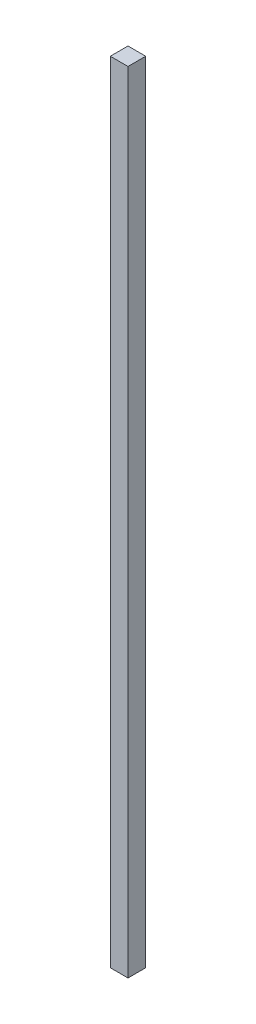
ISO-10303-21;
HEADER;
FILE_DESCRIPTION(('STEP AP214'),'2;1');
FILE_NAME('part.step','',(''),(''),'','','');
FILE_SCHEMA(('AUTOMOTIVE_DESIGN { 1 0 10303 214 1 1 1 1 }'));
ENDSEC;
DATA;
#1=APPLICATION_CONTEXT('core data for automotive mechanical design processes');
#2=APPLICATION_PROTOCOL_DEFINITION('international standard','automotive_design',2000,#1);
#3=PRODUCT_CONTEXT('',#1,'mechanical');
#4=PRODUCT('Part','Part','',(#3));
#5=PRODUCT_RELATED_PRODUCT_CATEGORY('part','',(#4));
#6=PRODUCT_DEFINITION_FORMATION('','',#4);
#7=PRODUCT_DEFINITION_CONTEXT('part definition',#1,'design');
#8=PRODUCT_DEFINITION('design','',#6,#7);
#9=PRODUCT_DEFINITION_SHAPE('','',#8);
#10=(LENGTH_UNIT() NAMED_UNIT(*) SI_UNIT(.MILLI.,.METRE.));
#11=(NAMED_UNIT(*) PLANE_ANGLE_UNIT() SI_UNIT($,.RADIAN.));
#12=(NAMED_UNIT(*) SI_UNIT($,.STERADIAN.) SOLID_ANGLE_UNIT());
#13=UNCERTAINTY_MEASURE_WITH_UNIT(LENGTH_MEASURE(1.E-05),#10,'distance_accuracy_value','');
#14=(GEOMETRIC_REPRESENTATION_CONTEXT(3) GLOBAL_UNCERTAINTY_ASSIGNED_CONTEXT((#13)) GLOBAL_UNIT_ASSIGNED_CONTEXT((#10,
#11,#12)) REPRESENTATION_CONTEXT('',''));
#15=CARTESIAN_POINT('',(0.,0.,0.));
#16=DIRECTION('',(0.,0.,1.));
#17=DIRECTION('',(1.,0.,0.));
#18=AXIS2_PLACEMENT_3D('',#15,#16,#17);
#19=CARTESIAN_POINT('',(44.45,0.,-44.45));
#20=DIRECTION('',(0.,0.,-1.));
#21=DIRECTION('',(-1.,0.,0.));
#22=AXIS2_PLACEMENT_3D('',#19,#20,#21);
#23=PLANE('',#22);
#24=DIRECTION('',(1.,0.,0.));
#25=VECTOR('',#24,1.);
#26=CARTESIAN_POINT('',(0.,1981.2,-44.45));
#27=LINE('',#26,#25);
#28=CARTESIAN_POINT('',(44.45,1981.2,-44.45));
#29=VERTEX_POINT('',#28);
#30=CARTESIAN_POINT('',(0.,1981.2,-44.45));
#31=VERTEX_POINT('',#30);
#32=EDGE_CURVE('E84',#29,#31,#27,.F.);
#33=ORIENTED_EDGE('',*,*,#32,.F.);
#34=DIRECTION('',(0.,1.,0.));
#35=VECTOR('',#34,1.);
#36=CARTESIAN_POINT('',(44.45,0.,-44.45));
#37=LINE('',#36,#35);
#38=CARTESIAN_POINT('',(44.45,0.,-44.45));
#39=VERTEX_POINT('',#38);
#40=EDGE_CURVE('E71',#39,#29,#37,.T.);
#41=ORIENTED_EDGE('',*,*,#40,.F.);
#42=DIRECTION('',(1.,0.,0.));
#43=VECTOR('',#42,1.);
#44=CARTESIAN_POINT('',(0.,0.,-44.45));
#45=LINE('',#44,#43);
#46=CARTESIAN_POINT('',(0.,0.,-44.45));
#47=VERTEX_POINT('',#46);
#48=EDGE_CURVE('E36',#39,#47,#45,.F.);
#49=ORIENTED_EDGE('',*,*,#48,.T.);
#50=DIRECTION('',(0.,1.,0.));
#51=VECTOR('',#50,1.);
#52=CARTESIAN_POINT('',(0.,0.,-44.45));
#53=LINE('',#52,#51);
#54=EDGE_CURVE('E97',#31,#47,#53,.F.);
#55=ORIENTED_EDGE('',*,*,#54,.F.);
#56=EDGE_LOOP('',(#33,#41,#49,#55));
#57=FACE_BOUND('',#56,.T.);
#58=ADVANCED_FACE('F33',(#57),#23,.T.);
#59=CARTESIAN_POINT('',(0.,0.,0.));
#60=DIRECTION('',(0.,1.,0.));
#61=DIRECTION('',(0.,0.,1.));
#62=AXIS2_PLACEMENT_3D('',#59,#60,#61);
#63=PLANE('',#62);
#64=DIRECTION('',(0.,0.,1.));
#65=VECTOR('',#64,1.);
#66=CARTESIAN_POINT('',(0.,0.,-44.45));
#67=LINE('',#66,#65);
#68=CARTESIAN_POINT('',(0.,0.,0.));
#69=VERTEX_POINT('',#68);
#70=EDGE_CURVE('E80',#47,#69,#67,.T.);
#71=ORIENTED_EDGE('',*,*,#70,.F.);
#72=ORIENTED_EDGE('',*,*,#48,.F.);
#73=DIRECTION('',(0.,0.,-1.));
#74=VECTOR('',#73,1.);
#75=CARTESIAN_POINT('',(44.45,0.,0.));
#76=LINE('',#75,#74);
#77=CARTESIAN_POINT('',(44.45,0.,0.));
#78=VERTEX_POINT('',#77);
#79=EDGE_CURVE('E77',#78,#39,#76,.T.);
#80=ORIENTED_EDGE('',*,*,#79,.F.);
#81=DIRECTION('',(1.,0.,0.));
#82=VECTOR('',#81,1.);
#83=CARTESIAN_POINT('',(0.,0.,0.));
#84=LINE('',#83,#82);
#85=EDGE_CURVE('E99',#69,#78,#84,.T.);
#86=ORIENTED_EDGE('',*,*,#85,.F.);
#87=EDGE_LOOP('',(#71,#72,#80,#86));
#88=FACE_BOUND('',#87,.T.);
#89=ADVANCED_FACE('F76',(#88),#63,.F.);
#90=CARTESIAN_POINT('',(44.45,0.,0.));
#91=DIRECTION('',(1.,0.,0.));
#92=DIRECTION('',(0.,0.,-1.));
#93=AXIS2_PLACEMENT_3D('',#90,#91,#92);
#94=PLANE('',#93);
#95=DIRECTION('',(0.,0.,1.));
#96=VECTOR('',#95,1.);
#97=CARTESIAN_POINT('',(44.45,1981.2,0.));
#98=LINE('',#97,#96);
#99=CARTESIAN_POINT('',(44.45,1981.2,0.));
#100=VERTEX_POINT('',#99);
#101=EDGE_CURVE('E86',#100,#29,#98,.F.);
#102=ORIENTED_EDGE('',*,*,#101,.F.);
#103=DIRECTION('',(0.,1.,0.));
#104=VECTOR('',#103,1.);
#105=CARTESIAN_POINT('',(44.45,0.,0.));
#106=LINE('',#105,#104);
#107=EDGE_CURVE('E90',#78,#100,#106,.T.);
#108=ORIENTED_EDGE('',*,*,#107,.F.);
#109=ORIENTED_EDGE('',*,*,#79,.T.);
#110=ORIENTED_EDGE('',*,*,#40,.T.);
#111=EDGE_LOOP('',(#102,#108,#109,#110));
#112=FACE_BOUND('',#111,.T.);
#113=ADVANCED_FACE('F88',(#112),#94,.T.);
#114=CARTESIAN_POINT('',(0.,1981.2,0.));
#115=DIRECTION('',(0.,1.,0.));
#116=DIRECTION('',(0.,0.,1.));
#117=AXIS2_PLACEMENT_3D('',#114,#115,#116);
#118=PLANE('',#117);
#119=ORIENTED_EDGE('',*,*,#32,.T.);
#120=DIRECTION('',(0.,0.,1.));
#121=VECTOR('',#120,1.);
#122=CARTESIAN_POINT('',(0.,1981.2,-44.45));
#123=LINE('',#122,#121);
#124=CARTESIAN_POINT('',(0.,1981.2,0.));
#125=VERTEX_POINT('',#124);
#126=EDGE_CURVE('E51',#125,#31,#123,.F.);
#127=ORIENTED_EDGE('',*,*,#126,.F.);
#128=DIRECTION('',(1.,0.,0.));
#129=VECTOR('',#128,1.);
#130=CARTESIAN_POINT('',(0.,1981.2,0.));
#131=LINE('',#130,#129);
#132=EDGE_CURVE('E42',#100,#125,#131,.F.);
#133=ORIENTED_EDGE('',*,*,#132,.F.);
#134=ORIENTED_EDGE('',*,*,#101,.T.);
#135=EDGE_LOOP('',(#119,#127,#133,#134));
#136=FACE_BOUND('',#135,.T.);
#137=ADVANCED_FACE('F105',(#136),#118,.T.);
#138=CARTESIAN_POINT('',(0.,0.,-44.45));
#139=DIRECTION('',(-1.,0.,0.));
#140=DIRECTION('',(0.,0.,1.));
#141=AXIS2_PLACEMENT_3D('',#138,#139,#140);
#142=PLANE('',#141);
#143=ORIENTED_EDGE('',*,*,#126,.T.);
#144=ORIENTED_EDGE('',*,*,#54,.T.);
#145=ORIENTED_EDGE('',*,*,#70,.T.);
#146=DIRECTION('',(0.,1.,0.));
#147=VECTOR('',#146,1.);
#148=CARTESIAN_POINT('',(0.,0.,0.));
#149=LINE('',#148,#147);
#150=EDGE_CURVE('E11',#125,#69,#149,.F.);
#151=ORIENTED_EDGE('',*,*,#150,.F.);
#152=EDGE_LOOP('',(#143,#144,#145,#151));
#153=FACE_BOUND('',#152,.T.);
#154=ADVANCED_FACE('F107',(#153),#142,.T.);
#155=CARTESIAN_POINT('',(0.,0.,0.));
#156=DIRECTION('',(0.,0.,1.));
#157=DIRECTION('',(1.,0.,0.));
#158=AXIS2_PLACEMENT_3D('',#155,#156,#157);
#159=PLANE('',#158);
#160=ORIENTED_EDGE('',*,*,#132,.T.);
#161=ORIENTED_EDGE('',*,*,#150,.T.);
#162=ORIENTED_EDGE('',*,*,#85,.T.);
#163=ORIENTED_EDGE('',*,*,#107,.T.);
#164=EDGE_LOOP('',(#160,#161,#162,#163));
#165=FACE_BOUND('',#164,.T.);
#166=ADVANCED_FACE('F104',(#165),#159,.T.);
#167=CLOSED_SHELL('',(#58,#89,#113,#137,#154,#166));
#168=MANIFOLD_SOLID_BREP('B2',#167);
#169=ADVANCED_BREP_SHAPE_REPRESENTATION('',(#18,#168),#14);
#170=SHAPE_DEFINITION_REPRESENTATION(#9,#169);
ENDSEC;
END-ISO-10303-21;
